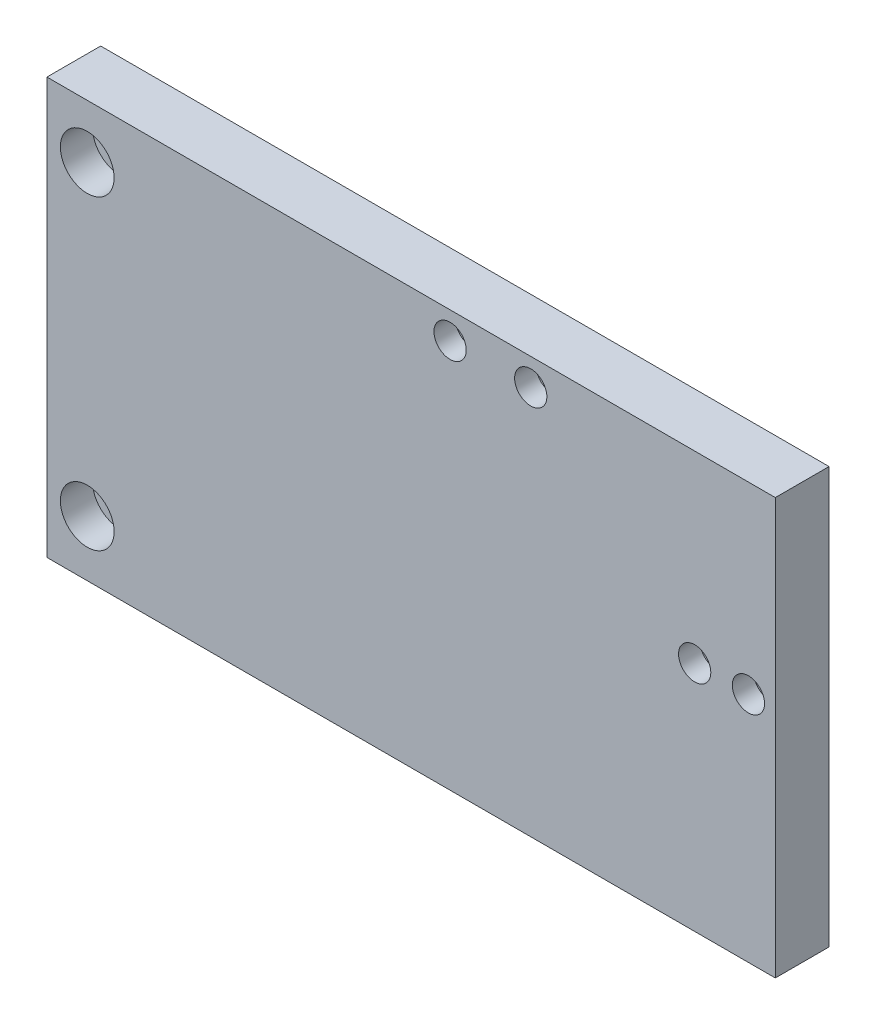
ISO-10303-21;
HEADER;
FILE_DESCRIPTION(('STEP AP214'),'2;1');
FILE_NAME('part.step','',(''),(''),'','','');
FILE_SCHEMA(('AUTOMOTIVE_DESIGN { 1 0 10303 214 1 1 1 1 }'));
ENDSEC;
DATA;
#1=APPLICATION_CONTEXT('core data for automotive mechanical design processes');
#2=APPLICATION_PROTOCOL_DEFINITION('international standard','automotive_design',2000,#1);
#3=PRODUCT_CONTEXT('',#1,'mechanical');
#4=PRODUCT('Part','Part','',(#3));
#5=PRODUCT_RELATED_PRODUCT_CATEGORY('part','',(#4));
#6=PRODUCT_DEFINITION_FORMATION('','',#4);
#7=PRODUCT_DEFINITION_CONTEXT('part definition',#1,'design');
#8=PRODUCT_DEFINITION('design','',#6,#7);
#9=PRODUCT_DEFINITION_SHAPE('','',#8);
#10=(LENGTH_UNIT() NAMED_UNIT(*) SI_UNIT(.MILLI.,.METRE.));
#11=(NAMED_UNIT(*) PLANE_ANGLE_UNIT() SI_UNIT($,.RADIAN.));
#12=(NAMED_UNIT(*) SI_UNIT($,.STERADIAN.) SOLID_ANGLE_UNIT());
#13=UNCERTAINTY_MEASURE_WITH_UNIT(LENGTH_MEASURE(1.E-05),#10,'distance_accuracy_value','');
#14=(GEOMETRIC_REPRESENTATION_CONTEXT(3) GLOBAL_UNCERTAINTY_ASSIGNED_CONTEXT((#13)) GLOBAL_UNIT_ASSIGNED_CONTEXT((#10,
#11,#12)) REPRESENTATION_CONTEXT('',''));
#15=CARTESIAN_POINT('',(0.,0.,0.));
#16=DIRECTION('',(0.,0.,1.));
#17=DIRECTION('',(1.,0.,0.));
#18=AXIS2_PLACEMENT_3D('',#15,#16,#17);
#19=CARTESIAN_POINT('',(0.,0.,10.));
#20=DIRECTION('',(1.,0.,0.));
#21=DIRECTION('',(0.,0.,-1.));
#22=AXIS2_PLACEMENT_3D('',#19,#20,#21);
#23=PLANE('',#22);
#24=DIRECTION('',(0.,-1.,0.));
#25=VECTOR('',#24,1.);
#26=CARTESIAN_POINT('',(0.,0.,0.));
#27=LINE('',#26,#25);
#28=CARTESIAN_POINT('',(0.,77.4,0.));
#29=VERTEX_POINT('',#28);
#30=CARTESIAN_POINT('',(0.,0.,0.));
#31=VERTEX_POINT('',#30);
#32=EDGE_CURVE('E104',#29,#31,#27,.T.);
#33=ORIENTED_EDGE('',*,*,#32,.T.);
#34=DIRECTION('',(0.,0.,-1.));
#35=VECTOR('',#34,1.);
#36=CARTESIAN_POINT('',(0.,0.,10.));
#37=LINE('',#36,#35);
#38=CARTESIAN_POINT('',(0.,0.,10.));
#39=VERTEX_POINT('',#38);
#40=EDGE_CURVE('E11',#39,#31,#37,.T.);
#41=ORIENTED_EDGE('',*,*,#40,.F.);
#42=DIRECTION('',(0.,-1.,0.));
#43=VECTOR('',#42,1.);
#44=CARTESIAN_POINT('',(0.,0.,10.));
#45=LINE('',#44,#43);
#46=CARTESIAN_POINT('',(0.,77.4,10.));
#47=VERTEX_POINT('',#46);
#48=EDGE_CURVE('E92',#47,#39,#45,.T.);
#49=ORIENTED_EDGE('',*,*,#48,.F.);
#50=DIRECTION('',(0.,0.,-1.));
#51=VECTOR('',#50,1.);
#52=CARTESIAN_POINT('',(0.,77.4,10.));
#53=LINE('',#52,#51);
#54=EDGE_CURVE('E100',#47,#29,#53,.T.);
#55=ORIENTED_EDGE('',*,*,#54,.T.);
#56=EDGE_LOOP('',(#33,#41,#49,#55));
#57=FACE_BOUND('',#56,.T.);
#58=ADVANCED_FACE('F41',(#57),#23,.F.);
#59=CARTESIAN_POINT('',(0.,0.,10.));
#60=DIRECTION('',(0.,1.,0.));
#61=DIRECTION('',(0.,0.,1.));
#62=AXIS2_PLACEMENT_3D('',#59,#60,#61);
#63=PLANE('',#62);
#64=DIRECTION('',(1.,0.,0.));
#65=VECTOR('',#64,1.);
#66=CARTESIAN_POINT('',(0.,0.,0.));
#67=LINE('',#66,#65);
#68=CARTESIAN_POINT('',(135.5,0.,0.));
#69=VERTEX_POINT('',#68);
#70=EDGE_CURVE('E96',#31,#69,#67,.T.);
#71=ORIENTED_EDGE('',*,*,#70,.T.);
#72=DIRECTION('',(0.,0.,-1.));
#73=VECTOR('',#72,1.);
#74=CARTESIAN_POINT('',(135.5,0.,10.));
#75=LINE('',#74,#73);
#76=CARTESIAN_POINT('',(135.5,0.,10.));
#77=VERTEX_POINT('',#76);
#78=EDGE_CURVE('E49',#77,#69,#75,.T.);
#79=ORIENTED_EDGE('',*,*,#78,.F.);
#80=DIRECTION('',(1.,0.,0.));
#81=VECTOR('',#80,1.);
#82=CARTESIAN_POINT('',(0.,0.,10.));
#83=LINE('',#82,#81);
#84=EDGE_CURVE('E87',#39,#77,#83,.T.);
#85=ORIENTED_EDGE('',*,*,#84,.F.);
#86=ORIENTED_EDGE('',*,*,#40,.T.);
#87=EDGE_LOOP('',(#71,#79,#85,#86));
#88=FACE_BOUND('',#87,.T.);
#89=ADVANCED_FACE('F95',(#88),#63,.F.);
#90=CARTESIAN_POINT('',(135.5,0.,10.));
#91=DIRECTION('',(-1.,0.,0.));
#92=DIRECTION('',(0.,0.,1.));
#93=AXIS2_PLACEMENT_3D('',#90,#91,#92);
#94=PLANE('',#93);
#95=DIRECTION('',(0.,1.,0.));
#96=VECTOR('',#95,1.);
#97=CARTESIAN_POINT('',(135.5,0.,0.));
#98=LINE('',#97,#96);
#99=CARTESIAN_POINT('',(135.5,77.4,0.));
#100=VERTEX_POINT('',#99);
#101=EDGE_CURVE('E74',#69,#100,#98,.T.);
#102=ORIENTED_EDGE('',*,*,#101,.T.);
#103=DIRECTION('',(0.,0.,-1.));
#104=VECTOR('',#103,1.);
#105=CARTESIAN_POINT('',(135.5,77.4,10.));
#106=LINE('',#105,#104);
#107=CARTESIAN_POINT('',(135.5,77.4,10.));
#108=VERTEX_POINT('',#107);
#109=EDGE_CURVE('E97',#108,#100,#106,.T.);
#110=ORIENTED_EDGE('',*,*,#109,.F.);
#111=DIRECTION('',(0.,1.,0.));
#112=VECTOR('',#111,1.);
#113=CARTESIAN_POINT('',(135.5,0.,10.));
#114=LINE('',#113,#112);
#115=EDGE_CURVE('E90',#77,#108,#114,.T.);
#116=ORIENTED_EDGE('',*,*,#115,.F.);
#117=ORIENTED_EDGE('',*,*,#78,.T.);
#118=EDGE_LOOP('',(#102,#110,#116,#117));
#119=FACE_BOUND('',#118,.T.);
#120=ADVANCED_FACE('F98',(#119),#94,.F.);
#121=CARTESIAN_POINT('',(0.,77.4,10.));
#122=DIRECTION('',(0.,-1.,0.));
#123=DIRECTION('',(0.,0.,-1.));
#124=AXIS2_PLACEMENT_3D('',#121,#122,#123);
#125=PLANE('',#124);
#126=DIRECTION('',(-1.,0.,0.));
#127=VECTOR('',#126,1.);
#128=CARTESIAN_POINT('',(0.,77.4,0.));
#129=LINE('',#128,#127);
#130=EDGE_CURVE('E80',#100,#29,#129,.T.);
#131=ORIENTED_EDGE('',*,*,#130,.T.);
#132=ORIENTED_EDGE('',*,*,#54,.F.);
#133=DIRECTION('',(-1.,0.,0.));
#134=VECTOR('',#133,1.);
#135=CARTESIAN_POINT('',(0.,77.4,10.));
#136=LINE('',#135,#134);
#137=EDGE_CURVE('E57',#108,#47,#136,.T.);
#138=ORIENTED_EDGE('',*,*,#137,.F.);
#139=ORIENTED_EDGE('',*,*,#109,.T.);
#140=EDGE_LOOP('',(#131,#132,#138,#139));
#141=FACE_BOUND('',#140,.T.);
#142=ADVANCED_FACE('F112',(#141),#125,.F.);
#143=CARTESIAN_POINT('',(0.,0.,10.));
#144=DIRECTION('',(0.,0.,-1.));
#145=DIRECTION('',(-1.,0.,0.));
#146=AXIS2_PLACEMENT_3D('',#143,#144,#145);
#147=PLANE('',#146);
#148=CARTESIAN_POINT('',(7.50000000000001,67.4,10.));
#149=DIRECTION('',(0.,0.,1.));
#150=DIRECTION('',(1.,0.,0.));
#151=AXIS2_PLACEMENT_3D('',#148,#149,#150);
#152=CIRCLE('',#151,5.);
#153=CARTESIAN_POINT('',(12.5,67.4,10.));
#154=VERTEX_POINT('',#153);
#155=EDGE_CURVE('E186',#154,#154,#152,.T.);
#156=ORIENTED_EDGE('',*,*,#155,.F.);
#157=EDGE_LOOP('',(#156));
#158=FACE_BOUND('',#157,.T.);
#159=CARTESIAN_POINT('',(7.5,10.4,10.));
#160=DIRECTION('',(0.,0.,1.));
#161=DIRECTION('',(1.,0.,0.));
#162=AXIS2_PLACEMENT_3D('',#159,#160,#161);
#163=CIRCLE('',#162,5.);
#164=CARTESIAN_POINT('',(12.5,10.4,10.));
#165=VERTEX_POINT('',#164);
#166=EDGE_CURVE('E174',#165,#165,#163,.T.);
#167=ORIENTED_EDGE('',*,*,#166,.F.);
#168=EDGE_LOOP('',(#167));
#169=FACE_BOUND('',#168,.T.);
#170=CARTESIAN_POINT('',(75.,72.4,10.));
#171=DIRECTION('',(0.,0.,1.));
#172=DIRECTION('',(1.,0.,0.));
#173=AXIS2_PLACEMENT_3D('',#170,#171,#172);
#174=CIRCLE('',#173,3.);
#175=CARTESIAN_POINT('',(78.,72.4,10.));
#176=VERTEX_POINT('',#175);
#177=EDGE_CURVE('E162',#176,#176,#174,.T.);
#178=ORIENTED_EDGE('',*,*,#177,.F.);
#179=EDGE_LOOP('',(#178));
#180=FACE_BOUND('',#179,.T.);
#181=CARTESIAN_POINT('',(90.,72.4,10.));
#182=DIRECTION('',(0.,0.,1.));
#183=DIRECTION('',(1.,0.,0.));
#184=AXIS2_PLACEMENT_3D('',#181,#182,#183);
#185=CIRCLE('',#184,3.);
#186=CARTESIAN_POINT('',(93.,72.4,10.));
#187=VERTEX_POINT('',#186);
#188=EDGE_CURVE('E150',#187,#187,#185,.T.);
#189=ORIENTED_EDGE('',*,*,#188,.F.);
#190=EDGE_LOOP('',(#189));
#191=FACE_BOUND('',#190,.T.);
#192=CARTESIAN_POINT('',(130.5,43.2,10.));
#193=DIRECTION('',(0.,0.,1.));
#194=DIRECTION('',(1.,0.,0.));
#195=AXIS2_PLACEMENT_3D('',#192,#193,#194);
#196=CIRCLE('',#195,3.);
#197=CARTESIAN_POINT('',(133.5,43.2,10.));
#198=VERTEX_POINT('',#197);
#199=EDGE_CURVE('E138',#198,#198,#196,.T.);
#200=ORIENTED_EDGE('',*,*,#199,.F.);
#201=EDGE_LOOP('',(#200));
#202=FACE_BOUND('',#201,.T.);
#203=CARTESIAN_POINT('',(120.5,43.2,10.));
#204=DIRECTION('',(0.,0.,1.));
#205=DIRECTION('',(1.,0.,0.));
#206=AXIS2_PLACEMENT_3D('',#203,#204,#205);
#207=CIRCLE('',#206,3.);
#208=CARTESIAN_POINT('',(123.5,43.2,10.));
#209=VERTEX_POINT('',#208);
#210=EDGE_CURVE('E126',#209,#209,#207,.T.);
#211=ORIENTED_EDGE('',*,*,#210,.F.);
#212=EDGE_LOOP('',(#211));
#213=FACE_BOUND('',#212,.T.);
#214=ORIENTED_EDGE('',*,*,#48,.T.);
#215=ORIENTED_EDGE('',*,*,#84,.T.);
#216=ORIENTED_EDGE('',*,*,#115,.T.);
#217=ORIENTED_EDGE('',*,*,#137,.T.);
#218=EDGE_LOOP('',(#214,#215,#216,#217));
#219=FACE_BOUND('',#218,.T.);
#220=ADVANCED_FACE('F88',(#158,#169,#180,#191,#202,#213,#219),#147,.F.);
#221=CARTESIAN_POINT('',(0.,0.,0.));
#222=DIRECTION('',(0.,0.,-1.));
#223=DIRECTION('',(-1.,0.,0.));
#224=AXIS2_PLACEMENT_3D('',#221,#222,#223);
#225=PLANE('',#224);
#226=CARTESIAN_POINT('',(7.50000000000001,67.4,0.));
#227=DIRECTION('',(0.,0.,1.));
#228=DIRECTION('',(1.,0.,0.));
#229=AXIS2_PLACEMENT_3D('',#226,#227,#228);
#230=CIRCLE('',#229,2.75);
#231=CARTESIAN_POINT('',(10.25,67.4,0.));
#232=VERTEX_POINT('',#231);
#233=EDGE_CURVE('E177',#232,#232,#230,.T.);
#234=ORIENTED_EDGE('',*,*,#233,.T.);
#235=EDGE_LOOP('',(#234));
#236=FACE_BOUND('',#235,.T.);
#237=CARTESIAN_POINT('',(7.5,10.4,0.));
#238=DIRECTION('',(0.,0.,1.));
#239=DIRECTION('',(1.,0.,0.));
#240=AXIS2_PLACEMENT_3D('',#237,#238,#239);
#241=CIRCLE('',#240,2.75);
#242=CARTESIAN_POINT('',(10.25,10.4,0.));
#243=VERTEX_POINT('',#242);
#244=EDGE_CURVE('E165',#243,#243,#241,.T.);
#245=ORIENTED_EDGE('',*,*,#244,.T.);
#246=EDGE_LOOP('',(#245));
#247=FACE_BOUND('',#246,.T.);
#248=CARTESIAN_POINT('',(75.,72.4,0.));
#249=DIRECTION('',(0.,0.,1.));
#250=DIRECTION('',(1.,0.,0.));
#251=AXIS2_PLACEMENT_3D('',#248,#249,#250);
#252=CIRCLE('',#251,1.69999999999999);
#253=CARTESIAN_POINT('',(76.7,72.4,0.));
#254=VERTEX_POINT('',#253);
#255=EDGE_CURVE('E153',#254,#254,#252,.T.);
#256=ORIENTED_EDGE('',*,*,#255,.T.);
#257=EDGE_LOOP('',(#256));
#258=FACE_BOUND('',#257,.T.);
#259=CARTESIAN_POINT('',(90.,72.4,0.));
#260=DIRECTION('',(0.,0.,1.));
#261=DIRECTION('',(1.,0.,0.));
#262=AXIS2_PLACEMENT_3D('',#259,#260,#261);
#263=CIRCLE('',#262,1.69999999999999);
#264=CARTESIAN_POINT('',(91.7,72.4,0.));
#265=VERTEX_POINT('',#264);
#266=EDGE_CURVE('E141',#265,#265,#263,.T.);
#267=ORIENTED_EDGE('',*,*,#266,.T.);
#268=EDGE_LOOP('',(#267));
#269=FACE_BOUND('',#268,.T.);
#270=CARTESIAN_POINT('',(130.5,43.2,0.));
#271=DIRECTION('',(0.,0.,-1.));
#272=DIRECTION('',(-1.,0.,0.));
#273=AXIS2_PLACEMENT_3D('',#270,#271,#272);
#274=CIRCLE('',#273,1.70000000000001);
#275=CARTESIAN_POINT('',(128.8,43.2,0.));
#276=VERTEX_POINT('',#275);
#277=EDGE_CURVE('E129',#276,#276,#274,.T.);
#278=ORIENTED_EDGE('',*,*,#277,.F.);
#279=EDGE_LOOP('',(#278));
#280=FACE_BOUND('',#279,.T.);
#281=CARTESIAN_POINT('',(120.5,43.2,0.));
#282=DIRECTION('',(0.,0.,-1.));
#283=DIRECTION('',(-1.,0.,0.));
#284=AXIS2_PLACEMENT_3D('',#281,#282,#283);
#285=CIRCLE('',#284,1.69999999999999);
#286=CARTESIAN_POINT('',(118.8,43.2,0.));
#287=VERTEX_POINT('',#286);
#288=EDGE_CURVE('E107',#287,#287,#285,.T.);
#289=ORIENTED_EDGE('',*,*,#288,.F.);
#290=EDGE_LOOP('',(#289));
#291=FACE_BOUND('',#290,.T.);
#292=ORIENTED_EDGE('',*,*,#32,.F.);
#293=ORIENTED_EDGE('',*,*,#130,.F.);
#294=ORIENTED_EDGE('',*,*,#101,.F.);
#295=ORIENTED_EDGE('',*,*,#70,.F.);
#296=EDGE_LOOP('',(#292,#293,#294,#295));
#297=FACE_BOUND('',#296,.T.);
#298=ADVANCED_FACE('F115',(#236,#247,#258,#269,#280,#291,#297),#225,.T.);
#299=CARTESIAN_POINT('',(120.5,43.2,10.));
#300=DIRECTION('',(0.,0.,1.));
#301=DIRECTION('',(1.,0.,0.));
#302=AXIS2_PLACEMENT_3D('',#299,#300,#301);
#303=CYLINDRICAL_SURFACE('',#302,1.69999999999999);
#304=CARTESIAN_POINT('',(120.5,43.2,6.));
#305=DIRECTION('',(0.,0.,1.));
#306=DIRECTION('',(1.,0.,0.));
#307=AXIS2_PLACEMENT_3D('',#304,#305,#306);
#308=CIRCLE('',#307,1.69999999999999);
#309=CARTESIAN_POINT('',(122.2,43.2,6.));
#310=VERTEX_POINT('',#309);
#311=EDGE_CURVE('E120',#310,#310,#308,.T.);
#312=ORIENTED_EDGE('',*,*,#311,.T.);
#313=EDGE_LOOP('',(#312));
#314=FACE_BOUND('',#313,.T.);
#315=ORIENTED_EDGE('',*,*,#288,.T.);
#316=EDGE_LOOP('',(#315));
#317=FACE_BOUND('',#316,.T.);
#318=ADVANCED_FACE('F218',(#314,#317),#303,.F.);
#319=CARTESIAN_POINT('',(122.2,43.2,6.));
#320=DIRECTION('',(0.,0.,-1.));
#321=DIRECTION('',(-1.,0.,0.));
#322=AXIS2_PLACEMENT_3D('',#319,#320,#321);
#323=PLANE('',#322);
#324=ORIENTED_EDGE('',*,*,#311,.F.);
#325=EDGE_LOOP('',(#324));
#326=FACE_BOUND('',#325,.T.);
#327=CARTESIAN_POINT('',(120.5,43.2,6.));
#328=DIRECTION('',(0.,0.,1.));
#329=DIRECTION('',(1.,0.,0.));
#330=AXIS2_PLACEMENT_3D('',#327,#328,#329);
#331=CIRCLE('',#330,3.);
#332=CARTESIAN_POINT('',(123.5,43.2,6.));
#333=VERTEX_POINT('',#332);
#334=EDGE_CURVE('E123',#333,#333,#331,.T.);
#335=ORIENTED_EDGE('',*,*,#334,.T.);
#336=EDGE_LOOP('',(#335));
#337=FACE_BOUND('',#336,.T.);
#338=ADVANCED_FACE('F208',(#326,#337),#323,.F.);
#339=CARTESIAN_POINT('',(120.5,43.2,10.));
#340=DIRECTION('',(0.,0.,1.));
#341=DIRECTION('',(1.,0.,0.));
#342=AXIS2_PLACEMENT_3D('',#339,#340,#341);
#343=CYLINDRICAL_SURFACE('',#342,3.);
#344=ORIENTED_EDGE('',*,*,#334,.F.);
#345=EDGE_LOOP('',(#344));
#346=FACE_BOUND('',#345,.T.);
#347=ORIENTED_EDGE('',*,*,#210,.T.);
#348=EDGE_LOOP('',(#347));
#349=FACE_BOUND('',#348,.T.);
#350=ADVANCED_FACE('F205',(#346,#349),#343,.F.);
#351=CARTESIAN_POINT('',(130.5,43.2,10.));
#352=DIRECTION('',(0.,0.,1.));
#353=DIRECTION('',(1.,0.,0.));
#354=AXIS2_PLACEMENT_3D('',#351,#352,#353);
#355=CYLINDRICAL_SURFACE('',#354,1.70000000000001);
#356=CARTESIAN_POINT('',(130.5,43.2,6.));
#357=DIRECTION('',(0.,0.,1.));
#358=DIRECTION('',(1.,0.,0.));
#359=AXIS2_PLACEMENT_3D('',#356,#357,#358);
#360=CIRCLE('',#359,1.70000000000001);
#361=CARTESIAN_POINT('',(132.2,43.2,6.));
#362=VERTEX_POINT('',#361);
#363=EDGE_CURVE('E132',#362,#362,#360,.T.);
#364=ORIENTED_EDGE('',*,*,#363,.T.);
#365=EDGE_LOOP('',(#364));
#366=FACE_BOUND('',#365,.T.);
#367=ORIENTED_EDGE('',*,*,#277,.T.);
#368=EDGE_LOOP('',(#367));
#369=FACE_BOUND('',#368,.T.);
#370=ADVANCED_FACE('F207',(#366,#369),#355,.F.);
#371=CARTESIAN_POINT('',(132.2,43.2,6.));
#372=DIRECTION('',(0.,0.,-1.));
#373=DIRECTION('',(-1.,0.,0.));
#374=AXIS2_PLACEMENT_3D('',#371,#372,#373);
#375=PLANE('',#374);
#376=ORIENTED_EDGE('',*,*,#363,.F.);
#377=EDGE_LOOP('',(#376));
#378=FACE_BOUND('',#377,.T.);
#379=CARTESIAN_POINT('',(130.5,43.2,6.));
#380=DIRECTION('',(0.,0.,1.));
#381=DIRECTION('',(1.,0.,0.));
#382=AXIS2_PLACEMENT_3D('',#379,#380,#381);
#383=CIRCLE('',#382,3.);
#384=CARTESIAN_POINT('',(133.5,43.2,6.));
#385=VERTEX_POINT('',#384);
#386=EDGE_CURVE('E135',#385,#385,#383,.T.);
#387=ORIENTED_EDGE('',*,*,#386,.T.);
#388=EDGE_LOOP('',(#387));
#389=FACE_BOUND('',#388,.T.);
#390=ADVANCED_FACE('F215',(#378,#389),#375,.F.);
#391=CARTESIAN_POINT('',(130.5,43.2,10.));
#392=DIRECTION('',(0.,0.,1.));
#393=DIRECTION('',(1.,0.,0.));
#394=AXIS2_PLACEMENT_3D('',#391,#392,#393);
#395=CYLINDRICAL_SURFACE('',#394,3.);
#396=ORIENTED_EDGE('',*,*,#386,.F.);
#397=EDGE_LOOP('',(#396));
#398=FACE_BOUND('',#397,.T.);
#399=ORIENTED_EDGE('',*,*,#199,.T.);
#400=EDGE_LOOP('',(#399));
#401=FACE_BOUND('',#400,.T.);
#402=ADVANCED_FACE('F273',(#398,#401),#395,.F.);
#403=CARTESIAN_POINT('',(90.,72.4,10.));
#404=DIRECTION('',(0.,0.,1.));
#405=DIRECTION('',(1.,0.,0.));
#406=AXIS2_PLACEMENT_3D('',#403,#404,#405);
#407=CYLINDRICAL_SURFACE('',#406,1.69999999999999);
#408=ORIENTED_EDGE('',*,*,#266,.F.);
#409=EDGE_LOOP('',(#408));
#410=FACE_BOUND('',#409,.T.);
#411=CARTESIAN_POINT('',(90.,72.4,6.));
#412=DIRECTION('',(0.,0.,1.));
#413=DIRECTION('',(1.,0.,0.));
#414=AXIS2_PLACEMENT_3D('',#411,#412,#413);
#415=CIRCLE('',#414,1.69999999999999);
#416=CARTESIAN_POINT('',(91.7,72.4,6.));
#417=VERTEX_POINT('',#416);
#418=EDGE_CURVE('E144',#417,#417,#415,.T.);
#419=ORIENTED_EDGE('',*,*,#418,.T.);
#420=EDGE_LOOP('',(#419));
#421=FACE_BOUND('',#420,.T.);
#422=ADVANCED_FACE('F283',(#410,#421),#407,.F.);
#423=CARTESIAN_POINT('',(91.7,72.4,6.));
#424=DIRECTION('',(0.,0.,-1.));
#425=DIRECTION('',(-1.,0.,0.));
#426=AXIS2_PLACEMENT_3D('',#423,#424,#425);
#427=PLANE('',#426);
#428=ORIENTED_EDGE('',*,*,#418,.F.);
#429=EDGE_LOOP('',(#428));
#430=FACE_BOUND('',#429,.T.);
#431=CARTESIAN_POINT('',(90.,72.4,6.));
#432=DIRECTION('',(0.,0.,1.));
#433=DIRECTION('',(1.,0.,0.));
#434=AXIS2_PLACEMENT_3D('',#431,#432,#433);
#435=CIRCLE('',#434,3.);
#436=CARTESIAN_POINT('',(93.,72.4,6.));
#437=VERTEX_POINT('',#436);
#438=EDGE_CURVE('E147',#437,#437,#435,.T.);
#439=ORIENTED_EDGE('',*,*,#438,.T.);
#440=EDGE_LOOP('',(#439));
#441=FACE_BOUND('',#440,.T.);
#442=ADVANCED_FACE('F293',(#430,#441),#427,.F.);
#443=CARTESIAN_POINT('',(90.,72.4,10.));
#444=DIRECTION('',(0.,0.,1.));
#445=DIRECTION('',(1.,0.,0.));
#446=AXIS2_PLACEMENT_3D('',#443,#444,#445);
#447=CYLINDRICAL_SURFACE('',#446,3.);
#448=ORIENTED_EDGE('',*,*,#438,.F.);
#449=EDGE_LOOP('',(#448));
#450=FACE_BOUND('',#449,.T.);
#451=ORIENTED_EDGE('',*,*,#188,.T.);
#452=EDGE_LOOP('',(#451));
#453=FACE_BOUND('',#452,.T.);
#454=ADVANCED_FACE('F303',(#450,#453),#447,.F.);
#455=CARTESIAN_POINT('',(75.,72.4,10.));
#456=DIRECTION('',(0.,0.,1.));
#457=DIRECTION('',(1.,0.,0.));
#458=AXIS2_PLACEMENT_3D('',#455,#456,#457);
#459=CYLINDRICAL_SURFACE('',#458,1.69999999999999);
#460=ORIENTED_EDGE('',*,*,#255,.F.);
#461=EDGE_LOOP('',(#460));
#462=FACE_BOUND('',#461,.T.);
#463=CARTESIAN_POINT('',(75.,72.4,6.));
#464=DIRECTION('',(0.,0.,1.));
#465=DIRECTION('',(1.,0.,0.));
#466=AXIS2_PLACEMENT_3D('',#463,#464,#465);
#467=CIRCLE('',#466,1.69999999999999);
#468=CARTESIAN_POINT('',(76.7,72.4,6.));
#469=VERTEX_POINT('',#468);
#470=EDGE_CURVE('E156',#469,#469,#467,.T.);
#471=ORIENTED_EDGE('',*,*,#470,.T.);
#472=EDGE_LOOP('',(#471));
#473=FACE_BOUND('',#472,.T.);
#474=ADVANCED_FACE('F313',(#462,#473),#459,.F.);
#475=CARTESIAN_POINT('',(76.7,72.4,6.));
#476=DIRECTION('',(0.,0.,-1.));
#477=DIRECTION('',(-1.,0.,0.));
#478=AXIS2_PLACEMENT_3D('',#475,#476,#477);
#479=PLANE('',#478);
#480=ORIENTED_EDGE('',*,*,#470,.F.);
#481=EDGE_LOOP('',(#480));
#482=FACE_BOUND('',#481,.T.);
#483=CARTESIAN_POINT('',(75.,72.4,6.));
#484=DIRECTION('',(0.,0.,1.));
#485=DIRECTION('',(1.,0.,0.));
#486=AXIS2_PLACEMENT_3D('',#483,#484,#485);
#487=CIRCLE('',#486,3.);
#488=CARTESIAN_POINT('',(78.,72.4,6.));
#489=VERTEX_POINT('',#488);
#490=EDGE_CURVE('E159',#489,#489,#487,.T.);
#491=ORIENTED_EDGE('',*,*,#490,.T.);
#492=EDGE_LOOP('',(#491));
#493=FACE_BOUND('',#492,.T.);
#494=ADVANCED_FACE('F323',(#482,#493),#479,.F.);
#495=CARTESIAN_POINT('',(75.,72.4,10.));
#496=DIRECTION('',(0.,0.,1.));
#497=DIRECTION('',(1.,0.,0.));
#498=AXIS2_PLACEMENT_3D('',#495,#496,#497);
#499=CYLINDRICAL_SURFACE('',#498,3.);
#500=ORIENTED_EDGE('',*,*,#490,.F.);
#501=EDGE_LOOP('',(#500));
#502=FACE_BOUND('',#501,.T.);
#503=ORIENTED_EDGE('',*,*,#177,.T.);
#504=EDGE_LOOP('',(#503));
#505=FACE_BOUND('',#504,.T.);
#506=ADVANCED_FACE('F333',(#502,#505),#499,.F.);
#507=CARTESIAN_POINT('',(7.5,10.4,10.));
#508=DIRECTION('',(0.,0.,1.));
#509=DIRECTION('',(1.,0.,0.));
#510=AXIS2_PLACEMENT_3D('',#507,#508,#509);
#511=CYLINDRICAL_SURFACE('',#510,2.75);
#512=ORIENTED_EDGE('',*,*,#244,.F.);
#513=EDGE_LOOP('',(#512));
#514=FACE_BOUND('',#513,.T.);
#515=CARTESIAN_POINT('',(7.5,10.4,4.));
#516=DIRECTION('',(0.,0.,1.));
#517=DIRECTION('',(1.,0.,0.));
#518=AXIS2_PLACEMENT_3D('',#515,#516,#517);
#519=CIRCLE('',#518,2.75);
#520=CARTESIAN_POINT('',(10.25,10.4,4.));
#521=VERTEX_POINT('',#520);
#522=EDGE_CURVE('E168',#521,#521,#519,.T.);
#523=ORIENTED_EDGE('',*,*,#522,.T.);
#524=EDGE_LOOP('',(#523));
#525=FACE_BOUND('',#524,.T.);
#526=ADVANCED_FACE('F343',(#514,#525),#511,.F.);
#527=CARTESIAN_POINT('',(10.25,10.4,4.));
#528=DIRECTION('',(0.,0.,-1.));
#529=DIRECTION('',(-1.,0.,0.));
#530=AXIS2_PLACEMENT_3D('',#527,#528,#529);
#531=PLANE('',#530);
#532=ORIENTED_EDGE('',*,*,#522,.F.);
#533=EDGE_LOOP('',(#532));
#534=FACE_BOUND('',#533,.T.);
#535=CARTESIAN_POINT('',(7.5,10.4,4.));
#536=DIRECTION('',(0.,0.,1.));
#537=DIRECTION('',(1.,0.,0.));
#538=AXIS2_PLACEMENT_3D('',#535,#536,#537);
#539=CIRCLE('',#538,5.);
#540=CARTESIAN_POINT('',(12.5,10.4,4.));
#541=VERTEX_POINT('',#540);
#542=EDGE_CURVE('E171',#541,#541,#539,.T.);
#543=ORIENTED_EDGE('',*,*,#542,.T.);
#544=EDGE_LOOP('',(#543));
#545=FACE_BOUND('',#544,.T.);
#546=ADVANCED_FACE('F353',(#534,#545),#531,.F.);
#547=CARTESIAN_POINT('',(7.5,10.4,10.));
#548=DIRECTION('',(0.,0.,1.));
#549=DIRECTION('',(1.,0.,0.));
#550=AXIS2_PLACEMENT_3D('',#547,#548,#549);
#551=CYLINDRICAL_SURFACE('',#550,5.);
#552=ORIENTED_EDGE('',*,*,#542,.F.);
#553=EDGE_LOOP('',(#552));
#554=FACE_BOUND('',#553,.T.);
#555=ORIENTED_EDGE('',*,*,#166,.T.);
#556=EDGE_LOOP('',(#555));
#557=FACE_BOUND('',#556,.T.);
#558=ADVANCED_FACE('F363',(#554,#557),#551,.F.);
#559=CARTESIAN_POINT('',(7.50000000000001,67.4,10.));
#560=DIRECTION('',(0.,0.,1.));
#561=DIRECTION('',(1.,0.,0.));
#562=AXIS2_PLACEMENT_3D('',#559,#560,#561);
#563=CYLINDRICAL_SURFACE('',#562,2.75);
#564=ORIENTED_EDGE('',*,*,#233,.F.);
#565=EDGE_LOOP('',(#564));
#566=FACE_BOUND('',#565,.T.);
#567=CARTESIAN_POINT('',(7.50000000000001,67.4,4.));
#568=DIRECTION('',(0.,0.,1.));
#569=DIRECTION('',(1.,0.,0.));
#570=AXIS2_PLACEMENT_3D('',#567,#568,#569);
#571=CIRCLE('',#570,2.75);
#572=CARTESIAN_POINT('',(10.25,67.4,4.));
#573=VERTEX_POINT('',#572);
#574=EDGE_CURVE('E180',#573,#573,#571,.T.);
#575=ORIENTED_EDGE('',*,*,#574,.T.);
#576=EDGE_LOOP('',(#575));
#577=FACE_BOUND('',#576,.T.);
#578=ADVANCED_FACE('F373',(#566,#577),#563,.F.);
#579=CARTESIAN_POINT('',(10.25,67.4,4.));
#580=DIRECTION('',(0.,0.,-1.));
#581=DIRECTION('',(-1.,0.,0.));
#582=AXIS2_PLACEMENT_3D('',#579,#580,#581);
#583=PLANE('',#582);
#584=ORIENTED_EDGE('',*,*,#574,.F.);
#585=EDGE_LOOP('',(#584));
#586=FACE_BOUND('',#585,.T.);
#587=CARTESIAN_POINT('',(7.50000000000001,67.4,4.));
#588=DIRECTION('',(0.,0.,1.));
#589=DIRECTION('',(1.,0.,0.));
#590=AXIS2_PLACEMENT_3D('',#587,#588,#589);
#591=CIRCLE('',#590,5.);
#592=CARTESIAN_POINT('',(12.5,67.4,4.));
#593=VERTEX_POINT('',#592);
#594=EDGE_CURVE('E183',#593,#593,#591,.T.);
#595=ORIENTED_EDGE('',*,*,#594,.T.);
#596=EDGE_LOOP('',(#595));
#597=FACE_BOUND('',#596,.T.);
#598=ADVANCED_FACE('F383',(#586,#597),#583,.F.);
#599=CARTESIAN_POINT('',(7.50000000000001,67.4,10.));
#600=DIRECTION('',(0.,0.,1.));
#601=DIRECTION('',(1.,0.,0.));
#602=AXIS2_PLACEMENT_3D('',#599,#600,#601);
#603=CYLINDRICAL_SURFACE('',#602,5.);
#604=ORIENTED_EDGE('',*,*,#594,.F.);
#605=EDGE_LOOP('',(#604));
#606=FACE_BOUND('',#605,.T.);
#607=ORIENTED_EDGE('',*,*,#155,.T.);
#608=EDGE_LOOP('',(#607));
#609=FACE_BOUND('',#608,.T.);
#610=ADVANCED_FACE('F190',(#606,#609),#603,.F.);
#611=CLOSED_SHELL('',(#58,#89,#120,#142,#220,#298,#318,#338,#350,#370,#390,#402,#422,#442,#454,
#474,#494,#506,#526,#546,#558,#578,#598,#610));
#612=MANIFOLD_SOLID_BREP('B2',#611);
#613=ADVANCED_BREP_SHAPE_REPRESENTATION('',(#18,#612),#14);
#614=SHAPE_DEFINITION_REPRESENTATION(#9,#613);
ENDSEC;
END-ISO-10303-21;
